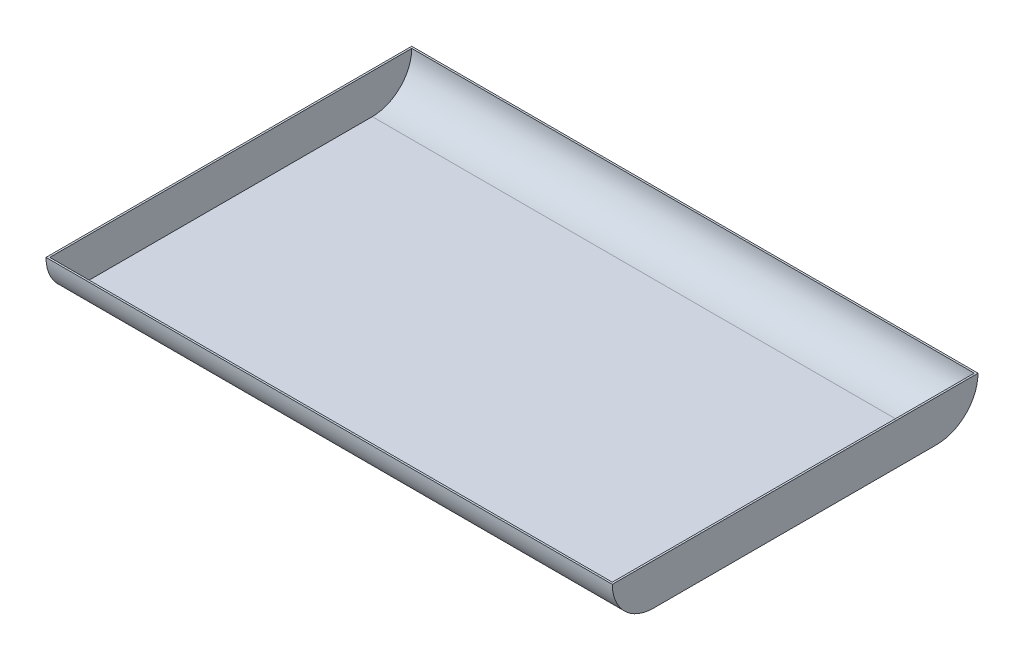
ISO-10303-21;
HEADER;
FILE_DESCRIPTION(('STEP AP214'),'2;1');
FILE_NAME('part.step','',(''),(''),'','','');
FILE_SCHEMA(('AUTOMOTIVE_DESIGN { 1 0 10303 214 1 1 1 1 }'));
ENDSEC;
DATA;
#1=APPLICATION_CONTEXT('core data for automotive mechanical design processes');
#2=APPLICATION_PROTOCOL_DEFINITION('international standard','automotive_design',2000,#1);
#3=PRODUCT_CONTEXT('',#1,'mechanical');
#4=PRODUCT('Part','Part','',(#3));
#5=PRODUCT_RELATED_PRODUCT_CATEGORY('part','',(#4));
#6=PRODUCT_DEFINITION_FORMATION('','',#4);
#7=PRODUCT_DEFINITION_CONTEXT('part definition',#1,'design');
#8=PRODUCT_DEFINITION('design','',#6,#7);
#9=PRODUCT_DEFINITION_SHAPE('','',#8);
#10=(LENGTH_UNIT() NAMED_UNIT(*) SI_UNIT(.MILLI.,.METRE.));
#11=(NAMED_UNIT(*) PLANE_ANGLE_UNIT() SI_UNIT($,.RADIAN.));
#12=(NAMED_UNIT(*) SI_UNIT($,.STERADIAN.) SOLID_ANGLE_UNIT());
#13=UNCERTAINTY_MEASURE_WITH_UNIT(LENGTH_MEASURE(1.E-05),#10,'distance_accuracy_value','');
#14=(GEOMETRIC_REPRESENTATION_CONTEXT(3) GLOBAL_UNCERTAINTY_ASSIGNED_CONTEXT((#13)) GLOBAL_UNIT_ASSIGNED_CONTEXT((#10,
#11,#12)) REPRESENTATION_CONTEXT('',''));
#15=CARTESIAN_POINT('',(0.,0.,0.));
#16=DIRECTION('',(0.,0.,1.));
#17=DIRECTION('',(1.,0.,0.));
#18=AXIS2_PLACEMENT_3D('',#15,#16,#17);
#19=CARTESIAN_POINT('',(-304.8,44.45,196.85));
#20=DIRECTION('',(0.,-1.,0.));
#21=DIRECTION('',(0.,0.,-1.));
#22=AXIS2_PLACEMENT_3D('',#19,#20,#21);
#23=PLANE('',#22);
#24=DIRECTION('',(1.,0.,0.));
#25=VECTOR('',#24,1.);
#26=CARTESIAN_POINT('',(-304.8,44.45,196.85));
#27=LINE('',#26,#25);
#28=CARTESIAN_POINT('',(-304.8,44.45,196.85));
#29=VERTEX_POINT('',#28);
#30=CARTESIAN_POINT('',(304.8,44.45,196.85));
#31=VERTEX_POINT('',#30);
#32=EDGE_CURVE('E11',#29,#31,#27,.T.);
#33=ORIENTED_EDGE('',*,*,#32,.T.);
#34=DIRECTION('',(0.,0.,-1.));
#35=VECTOR('',#34,1.);
#36=CARTESIAN_POINT('',(304.8,44.45,196.85));
#37=LINE('',#36,#35);
#38=CARTESIAN_POINT('',(304.8,44.45,-196.85));
#39=VERTEX_POINT('',#38);
#40=EDGE_CURVE('E149',#31,#39,#37,.T.);
#41=ORIENTED_EDGE('',*,*,#40,.T.);
#42=DIRECTION('',(1.,0.,0.));
#43=VECTOR('',#42,1.);
#44=CARTESIAN_POINT('',(-304.8,44.45,-196.85));
#45=LINE('',#44,#43);
#46=CARTESIAN_POINT('',(-304.8,44.45,-196.85));
#47=VERTEX_POINT('',#46);
#48=EDGE_CURVE('E48',#47,#39,#45,.T.);
#49=ORIENTED_EDGE('',*,*,#48,.F.);
#50=DIRECTION('',(0.,0.,-1.));
#51=VECTOR('',#50,1.);
#52=CARTESIAN_POINT('',(-304.8,44.45,196.85));
#53=LINE('',#52,#51);
#54=EDGE_CURVE('E161',#29,#47,#53,.T.);
#55=ORIENTED_EDGE('',*,*,#54,.F.);
#56=EDGE_LOOP('',(#33,#41,#49,#55));
#57=FACE_BOUND('',#56,.T.);
#58=DIRECTION('',(1.,0.,0.));
#59=VECTOR('',#58,1.);
#60=CARTESIAN_POINT('',(-302.8,44.45,194.85));
#61=LINE('',#60,#59);
#62=CARTESIAN_POINT('',(-302.8,44.45,194.85));
#63=VERTEX_POINT('',#62);
#64=CARTESIAN_POINT('',(302.8,44.45,194.85));
#65=VERTEX_POINT('',#64);
#66=EDGE_CURVE('E129',#63,#65,#61,.T.);
#67=ORIENTED_EDGE('',*,*,#66,.F.);
#68=DIRECTION('',(0.,0.,-1.));
#69=VECTOR('',#68,1.);
#70=CARTESIAN_POINT('',(-302.8,44.45,196.85));
#71=LINE('',#70,#69);
#72=CARTESIAN_POINT('',(-302.8,44.45,-194.85));
#73=VERTEX_POINT('',#72);
#74=EDGE_CURVE('E135',#63,#73,#71,.T.);
#75=ORIENTED_EDGE('',*,*,#74,.T.);
#76=DIRECTION('',(1.,0.,0.));
#77=VECTOR('',#76,1.);
#78=CARTESIAN_POINT('',(-302.8,44.45,-194.85));
#79=LINE('',#78,#77);
#80=CARTESIAN_POINT('',(302.8,44.45,-194.85));
#81=VERTEX_POINT('',#80);
#82=EDGE_CURVE('E136',#73,#81,#79,.T.);
#83=ORIENTED_EDGE('',*,*,#82,.T.);
#84=DIRECTION('',(0.,0.,-1.));
#85=VECTOR('',#84,1.);
#86=CARTESIAN_POINT('',(302.8,44.45,196.85));
#87=LINE('',#86,#85);
#88=EDGE_CURVE('E130',#65,#81,#87,.T.);
#89=ORIENTED_EDGE('',*,*,#88,.F.);
#90=EDGE_LOOP('',(#67,#75,#83,#89));
#91=FACE_BOUND('',#90,.T.);
#92=ADVANCED_FACE('F40',(#57,#91),#23,.F.);
#93=CARTESIAN_POINT('',(-304.8,44.45,152.4));
#94=DIRECTION('',(1.,0.,0.));
#95=DIRECTION('',(0.,0.,-1.));
#96=AXIS2_PLACEMENT_3D('',#93,#94,#95);
#97=CYLINDRICAL_SURFACE('',#96,44.45);
#98=DIRECTION('',(1.,0.,0.));
#99=VECTOR('',#98,1.);
#100=CARTESIAN_POINT('',(-304.8,0.,152.4));
#101=LINE('',#100,#99);
#102=CARTESIAN_POINT('',(-304.8,0.,152.4));
#103=VERTEX_POINT('',#102);
#104=CARTESIAN_POINT('',(304.8,0.,152.4));
#105=VERTEX_POINT('',#104);
#106=EDGE_CURVE('E63',#103,#105,#101,.T.);
#107=ORIENTED_EDGE('',*,*,#106,.T.);
#108=CARTESIAN_POINT('',(304.8,44.45,152.4));
#109=DIRECTION('',(-1.,0.,0.));
#110=DIRECTION('',(0.,0.,1.));
#111=AXIS2_PLACEMENT_3D('',#108,#109,#110);
#112=CIRCLE('',#111,44.45);
#113=EDGE_CURVE('E141',#105,#31,#112,.T.);
#114=ORIENTED_EDGE('',*,*,#113,.T.);
#115=ORIENTED_EDGE('',*,*,#32,.F.);
#116=CARTESIAN_POINT('',(-304.8,44.45,152.4));
#117=DIRECTION('',(-1.,0.,0.));
#118=DIRECTION('',(0.,0.,1.));
#119=AXIS2_PLACEMENT_3D('',#116,#117,#118);
#120=CIRCLE('',#119,44.45);
#121=EDGE_CURVE('E158',#103,#29,#120,.T.);
#122=ORIENTED_EDGE('',*,*,#121,.F.);
#123=EDGE_LOOP('',(#107,#114,#115,#122));
#124=FACE_BOUND('',#123,.T.);
#125=ADVANCED_FACE('F42',(#124),#97,.T.);
#126=CARTESIAN_POINT('',(-304.8,44.45,-152.4));
#127=DIRECTION('',(1.,0.,0.));
#128=DIRECTION('',(0.,0.,-1.));
#129=AXIS2_PLACEMENT_3D('',#126,#127,#128);
#130=CYLINDRICAL_SURFACE('',#129,44.45);
#131=ORIENTED_EDGE('',*,*,#48,.T.);
#132=CARTESIAN_POINT('',(304.8,44.45,-152.4));
#133=DIRECTION('',(1.,0.,0.));
#134=DIRECTION('',(0.,0.,-1.));
#135=AXIS2_PLACEMENT_3D('',#132,#133,#134);
#136=CIRCLE('',#135,44.45);
#137=CARTESIAN_POINT('',(304.8,0.,-152.4));
#138=VERTEX_POINT('',#137);
#139=EDGE_CURVE('E152',#138,#39,#136,.T.);
#140=ORIENTED_EDGE('',*,*,#139,.F.);
#141=DIRECTION('',(1.,0.,0.));
#142=VECTOR('',#141,1.);
#143=CARTESIAN_POINT('',(-304.8,0.,-152.4));
#144=LINE('',#143,#142);
#145=CARTESIAN_POINT('',(-304.8,0.,-152.4));
#146=VERTEX_POINT('',#145);
#147=EDGE_CURVE('E169',#146,#138,#144,.T.);
#148=ORIENTED_EDGE('',*,*,#147,.F.);
#149=CARTESIAN_POINT('',(-304.8,44.45,-152.4));
#150=DIRECTION('',(1.,0.,0.));
#151=DIRECTION('',(0.,0.,-1.));
#152=AXIS2_PLACEMENT_3D('',#149,#150,#151);
#153=CIRCLE('',#152,44.45);
#154=EDGE_CURVE('E163',#146,#47,#153,.T.);
#155=ORIENTED_EDGE('',*,*,#154,.T.);
#156=EDGE_LOOP('',(#131,#140,#148,#155));
#157=FACE_BOUND('',#156,.T.);
#158=ADVANCED_FACE('F173',(#157),#130,.T.);
#159=CARTESIAN_POINT('',(-304.8,0.,152.4));
#160=DIRECTION('',(0.,-1.,0.));
#161=DIRECTION('',(0.,0.,-1.));
#162=AXIS2_PLACEMENT_3D('',#159,#160,#161);
#163=PLANE('',#162);
#164=ORIENTED_EDGE('',*,*,#147,.T.);
#165=DIRECTION('',(0.,0.,-1.));
#166=VECTOR('',#165,1.);
#167=CARTESIAN_POINT('',(304.8,0.,152.4));
#168=LINE('',#167,#166);
#169=EDGE_CURVE('E155',#105,#138,#168,.T.);
#170=ORIENTED_EDGE('',*,*,#169,.F.);
#171=ORIENTED_EDGE('',*,*,#106,.F.);
#172=DIRECTION('',(0.,0.,-1.));
#173=VECTOR('',#172,1.);
#174=CARTESIAN_POINT('',(-304.8,0.,152.4));
#175=LINE('',#174,#173);
#176=EDGE_CURVE('E166',#103,#146,#175,.T.);
#177=ORIENTED_EDGE('',*,*,#176,.T.);
#178=EDGE_LOOP('',(#164,#170,#171,#177));
#179=FACE_BOUND('',#178,.T.);
#180=ADVANCED_FACE('F184',(#179),#163,.T.);
#181=CARTESIAN_POINT('',(-304.8,44.45,152.4));
#182=DIRECTION('',(-1.,0.,0.));
#183=DIRECTION('',(0.,0.,1.));
#184=AXIS2_PLACEMENT_3D('',#181,#182,#183);
#185=PLANE('',#184);
#186=ORIENTED_EDGE('',*,*,#121,.T.);
#187=ORIENTED_EDGE('',*,*,#54,.T.);
#188=ORIENTED_EDGE('',*,*,#154,.F.);
#189=ORIENTED_EDGE('',*,*,#176,.F.);
#190=EDGE_LOOP('',(#186,#187,#188,#189));
#191=FACE_BOUND('',#190,.T.);
#192=ADVANCED_FACE('F186',(#191),#185,.T.);
#193=CARTESIAN_POINT('',(304.8,44.45,152.4));
#194=DIRECTION('',(-1.,0.,0.));
#195=DIRECTION('',(0.,0.,1.));
#196=AXIS2_PLACEMENT_3D('',#193,#194,#195);
#197=PLANE('',#196);
#198=ORIENTED_EDGE('',*,*,#113,.F.);
#199=ORIENTED_EDGE('',*,*,#169,.T.);
#200=ORIENTED_EDGE('',*,*,#139,.T.);
#201=ORIENTED_EDGE('',*,*,#40,.F.);
#202=EDGE_LOOP('',(#198,#199,#200,#201));
#203=FACE_BOUND('',#202,.T.);
#204=ADVANCED_FACE('F179',(#203),#197,.F.);
#205=CARTESIAN_POINT('',(-304.8,44.45,152.4));
#206=DIRECTION('',(1.,0.,0.));
#207=DIRECTION('',(0.,0.,-1.));
#208=AXIS2_PLACEMENT_3D('',#205,#206,#207);
#209=CYLINDRICAL_SURFACE('',#208,42.45);
#210=DIRECTION('',(1.,0.,0.));
#211=VECTOR('',#210,1.);
#212=CARTESIAN_POINT('',(-304.8,2.00000000000003,152.4));
#213=LINE('',#212,#211);
#214=CARTESIAN_POINT('',(-302.8,2.00000000000003,152.4));
#215=VERTEX_POINT('',#214);
#216=CARTESIAN_POINT('',(302.8,2.00000000000003,152.4));
#217=VERTEX_POINT('',#216);
#218=EDGE_CURVE('E106',#215,#217,#213,.T.);
#219=ORIENTED_EDGE('',*,*,#218,.F.);
#220=CARTESIAN_POINT('',(-302.8,44.45,152.4));
#221=DIRECTION('',(-1.,0.,0.));
#222=DIRECTION('',(0.,0.,1.));
#223=AXIS2_PLACEMENT_3D('',#220,#221,#222);
#224=CIRCLE('',#223,42.45);
#225=EDGE_CURVE('E125',#215,#63,#224,.T.);
#226=ORIENTED_EDGE('',*,*,#225,.T.);
#227=ORIENTED_EDGE('',*,*,#66,.T.);
#228=CARTESIAN_POINT('',(302.8,44.45,152.4));
#229=DIRECTION('',(-1.,0.,0.));
#230=DIRECTION('',(0.,0.,1.));
#231=AXIS2_PLACEMENT_3D('',#228,#229,#230);
#232=CIRCLE('',#231,42.45);
#233=EDGE_CURVE('E122',#217,#65,#232,.T.);
#234=ORIENTED_EDGE('',*,*,#233,.F.);
#235=EDGE_LOOP('',(#219,#226,#227,#234));
#236=FACE_BOUND('',#235,.T.);
#237=ADVANCED_FACE('F127',(#236),#209,.F.);
#238=CARTESIAN_POINT('',(-304.8,44.45,-152.4));
#239=DIRECTION('',(1.,0.,0.));
#240=DIRECTION('',(0.,0.,-1.));
#241=AXIS2_PLACEMENT_3D('',#238,#239,#240);
#242=CYLINDRICAL_SURFACE('',#241,42.45);
#243=ORIENTED_EDGE('',*,*,#82,.F.);
#244=CARTESIAN_POINT('',(-302.8,44.45,-152.4));
#245=DIRECTION('',(-1.,0.,0.));
#246=DIRECTION('',(0.,0.,1.));
#247=AXIS2_PLACEMENT_3D('',#244,#245,#246);
#248=CIRCLE('',#247,42.45);
#249=CARTESIAN_POINT('',(-302.8,2.,-152.4));
#250=VERTEX_POINT('',#249);
#251=EDGE_CURVE('E55',#250,#73,#248,.F.);
#252=ORIENTED_EDGE('',*,*,#251,.F.);
#253=DIRECTION('',(1.,0.,0.));
#254=VECTOR('',#253,1.);
#255=CARTESIAN_POINT('',(-304.8,2.,-152.4));
#256=LINE('',#255,#254);
#257=CARTESIAN_POINT('',(302.8,2.,-152.4));
#258=VERTEX_POINT('',#257);
#259=EDGE_CURVE('E116',#250,#258,#256,.T.);
#260=ORIENTED_EDGE('',*,*,#259,.T.);
#261=CARTESIAN_POINT('',(302.8,44.45,-152.4));
#262=DIRECTION('',(-1.,0.,0.));
#263=DIRECTION('',(0.,0.,1.));
#264=AXIS2_PLACEMENT_3D('',#261,#262,#263);
#265=CIRCLE('',#264,42.45);
#266=EDGE_CURVE('E124',#258,#81,#265,.F.);
#267=ORIENTED_EDGE('',*,*,#266,.T.);
#268=EDGE_LOOP('',(#243,#252,#260,#267));
#269=FACE_BOUND('',#268,.T.);
#270=ADVANCED_FACE('F236',(#269),#242,.F.);
#271=CARTESIAN_POINT('',(-304.8,2.,152.4));
#272=DIRECTION('',(0.,-1.,0.));
#273=DIRECTION('',(0.,0.,-1.));
#274=AXIS2_PLACEMENT_3D('',#271,#272,#273);
#275=PLANE('',#274);
#276=ORIENTED_EDGE('',*,*,#259,.F.);
#277=DIRECTION('',(0.,0.,-1.));
#278=VECTOR('',#277,1.);
#279=CARTESIAN_POINT('',(-302.8,2.,152.4));
#280=LINE('',#279,#278);
#281=EDGE_CURVE('E111',#215,#250,#280,.T.);
#282=ORIENTED_EDGE('',*,*,#281,.F.);
#283=ORIENTED_EDGE('',*,*,#218,.T.);
#284=DIRECTION('',(0.,0.,-1.));
#285=VECTOR('',#284,1.);
#286=CARTESIAN_POINT('',(302.8,2.,152.4));
#287=LINE('',#286,#285);
#288=EDGE_CURVE('E109',#217,#258,#287,.T.);
#289=ORIENTED_EDGE('',*,*,#288,.T.);
#290=EDGE_LOOP('',(#276,#282,#283,#289));
#291=FACE_BOUND('',#290,.T.);
#292=ADVANCED_FACE('F108',(#291),#275,.F.);
#293=CARTESIAN_POINT('',(-302.8,44.45,152.4));
#294=DIRECTION('',(-1.,0.,0.));
#295=DIRECTION('',(0.,0.,1.));
#296=AXIS2_PLACEMENT_3D('',#293,#294,#295);
#297=PLANE('',#296);
#298=ORIENTED_EDGE('',*,*,#225,.F.);
#299=ORIENTED_EDGE('',*,*,#281,.T.);
#300=ORIENTED_EDGE('',*,*,#251,.T.);
#301=ORIENTED_EDGE('',*,*,#74,.F.);
#302=EDGE_LOOP('',(#298,#299,#300,#301));
#303=FACE_BOUND('',#302,.T.);
#304=ADVANCED_FACE('F255',(#303),#297,.F.);
#305=CARTESIAN_POINT('',(302.8,44.45,152.4));
#306=DIRECTION('',(-1.,0.,0.));
#307=DIRECTION('',(0.,0.,1.));
#308=AXIS2_PLACEMENT_3D('',#305,#306,#307);
#309=PLANE('',#308);
#310=ORIENTED_EDGE('',*,*,#233,.T.);
#311=ORIENTED_EDGE('',*,*,#88,.T.);
#312=ORIENTED_EDGE('',*,*,#266,.F.);
#313=ORIENTED_EDGE('',*,*,#288,.F.);
#314=EDGE_LOOP('',(#310,#311,#312,#313));
#315=FACE_BOUND('',#314,.T.);
#316=ADVANCED_FACE('F120',(#315),#309,.T.);
#317=CLOSED_SHELL('',(#92,#125,#158,#180,#192,#204,#237,#270,#292,#304,#316));
#318=MANIFOLD_SOLID_BREP('B2',#317);
#319=ADVANCED_BREP_SHAPE_REPRESENTATION('',(#18,#318),#14);
#320=SHAPE_DEFINITION_REPRESENTATION(#9,#319);
ENDSEC;
END-ISO-10303-21;
